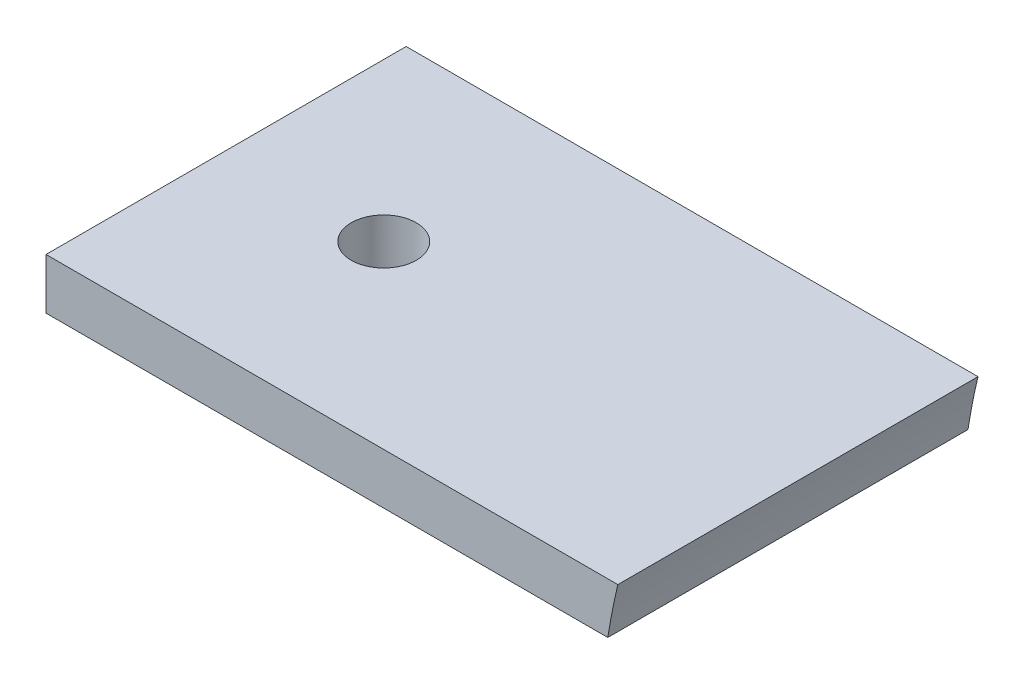
ISO-10303-21;
HEADER;
FILE_DESCRIPTION(('STEP AP214'),'2;1');
FILE_NAME('part.step','',(''),(''),'','','');
FILE_SCHEMA(('AUTOMOTIVE_DESIGN { 1 0 10303 214 1 1 1 1 }'));
ENDSEC;
DATA;
#1=APPLICATION_CONTEXT('core data for automotive mechanical design processes');
#2=APPLICATION_PROTOCOL_DEFINITION('international standard','automotive_design',2000,#1);
#3=PRODUCT_CONTEXT('',#1,'mechanical');
#4=PRODUCT('Part','Part','',(#3));
#5=PRODUCT_RELATED_PRODUCT_CATEGORY('part','',(#4));
#6=PRODUCT_DEFINITION_FORMATION('','',#4);
#7=PRODUCT_DEFINITION_CONTEXT('part definition',#1,'design');
#8=PRODUCT_DEFINITION('design','',#6,#7);
#9=PRODUCT_DEFINITION_SHAPE('','',#8);
#10=(LENGTH_UNIT() NAMED_UNIT(*) SI_UNIT(.MILLI.,.METRE.));
#11=(NAMED_UNIT(*) PLANE_ANGLE_UNIT() SI_UNIT($,.RADIAN.));
#12=(NAMED_UNIT(*) SI_UNIT($,.STERADIAN.) SOLID_ANGLE_UNIT());
#13=UNCERTAINTY_MEASURE_WITH_UNIT(LENGTH_MEASURE(1.E-05),#10,'distance_accuracy_value','');
#14=(GEOMETRIC_REPRESENTATION_CONTEXT(3) GLOBAL_UNCERTAINTY_ASSIGNED_CONTEXT((#13)) GLOBAL_UNIT_ASSIGNED_CONTEXT((#10,
#11,#12)) REPRESENTATION_CONTEXT('',''));
#15=CARTESIAN_POINT('',(0.,0.,0.));
#16=DIRECTION('',(0.,0.,1.));
#17=DIRECTION('',(1.,0.,0.));
#18=AXIS2_PLACEMENT_3D('',#15,#16,#17);
#19=CARTESIAN_POINT('',(-29.656098874284,20.5,291556.514563107));
#20=DIRECTION('',(1.,0.,0.));
#21=DIRECTION('',(0.,0.,-1.));
#22=AXIS2_PLACEMENT_3D('',#19,#20,#21);
#23=PLANE('',#22);
#24=DIRECTION('',(0.,1.,0.));
#25=VECTOR('',#24,1.);
#26=CARTESIAN_POINT('',(-29.656098874284,20.5,-7.39382756529494));
#27=LINE('',#26,#25);
#28=CARTESIAN_POINT('',(-29.656098874284,24.25,-7.39382756529494));
#29=VERTEX_POINT('',#28);
#30=CARTESIAN_POINT('',(-29.656098874284,25.5,-7.39382756529494));
#31=VERTEX_POINT('',#30);
#32=EDGE_CURVE('E40',#29,#31,#27,.T.);
#33=ORIENTED_EDGE('',*,*,#32,.F.);
#34=DIRECTION('',(0.,0.,1.));
#35=VECTOR('',#34,1.);
#36=CARTESIAN_POINT('',(-29.656098874284,24.25,291556.514563107));
#37=LINE('',#36,#35);
#38=CARTESIAN_POINT('',(-29.656098874284,24.25,1.46192518337784));
#39=VERTEX_POINT('',#38);
#40=EDGE_CURVE('E105',#29,#39,#37,.T.);
#41=ORIENTED_EDGE('',*,*,#40,.T.);
#42=DIRECTION('',(0.,1.,0.));
#43=VECTOR('',#42,1.);
#44=CARTESIAN_POINT('',(-29.656098874284,20.5,1.46192518337784));
#45=LINE('',#44,#43);
#46=CARTESIAN_POINT('',(-29.656098874284,25.5,1.46192518337784));
#47=VERTEX_POINT('',#46);
#48=EDGE_CURVE('E11',#39,#47,#45,.T.);
#49=ORIENTED_EDGE('',*,*,#48,.T.);
#50=DIRECTION('',(0.,0.,-1.));
#51=VECTOR('',#50,1.);
#52=CARTESIAN_POINT('',(-29.656098874284,25.5,291556.514563107));
#53=LINE('',#52,#51);
#54=EDGE_CURVE('E85',#47,#31,#53,.T.);
#55=ORIENTED_EDGE('',*,*,#54,.T.);
#56=EDGE_LOOP('',(#33,#41,#49,#55));
#57=FACE_BOUND('',#56,.T.);
#58=ADVANCED_FACE('F36',(#57),#23,.F.);
#59=CARTESIAN_POINT('',(-25.7794462528812,25.5,-2.96595119095855));
#60=DIRECTION('',(0.,1.,0.));
#61=DIRECTION('',(0.,0.,1.));
#62=AXIS2_PLACEMENT_3D('',#59,#60,#61);
#63=CYLINDRICAL_SURFACE('',#62,0.799999999999999);
#64=CARTESIAN_POINT('',(-25.7794462528812,24.25,-2.96595119095855));
#65=DIRECTION('',(0.,1.,0.));
#66=DIRECTION('',(-1.,0.,0.));
#67=AXIS2_PLACEMENT_3D('',#64,#65,#66);
#68=CIRCLE('',#67,0.799999999999999);
#69=CARTESIAN_POINT('',(-26.5794462528812,24.25,-2.96595119095855));
#70=VERTEX_POINT('',#69);
#71=EDGE_CURVE('E109',#70,#70,#68,.F.);
#72=ORIENTED_EDGE('',*,*,#71,.T.);
#73=EDGE_LOOP('',(#72));
#74=FACE_BOUND('',#73,.T.);
#75=CARTESIAN_POINT('',(-25.7794462528812,25.5,-2.96595119095855));
#76=DIRECTION('',(0.,1.,0.));
#77=DIRECTION('',(0.,0.,1.));
#78=AXIS2_PLACEMENT_3D('',#75,#76,#77);
#79=CIRCLE('',#78,0.799999999999999);
#80=CARTESIAN_POINT('',(-25.7794462528812,25.5,-2.16595119095855));
#81=VERTEX_POINT('',#80);
#82=EDGE_CURVE('E86',#81,#81,#79,.T.);
#83=ORIENTED_EDGE('',*,*,#82,.T.);
#84=EDGE_LOOP('',(#83));
#85=FACE_BOUND('',#84,.T.);
#86=ADVANCED_FACE('F125',(#74,#85),#63,.F.);
#87=CARTESIAN_POINT('',(0.,25.5,0.));
#88=DIRECTION('',(0.,-1.,0.));
#89=DIRECTION('',(0.,0.,-1.));
#90=AXIS2_PLACEMENT_3D('',#87,#88,#89);
#91=PLANE('',#90);
#92=DIRECTION('',(-1.,0.,0.));
#93=VECTOR('',#92,1.);
#94=CARTESIAN_POINT('',(-400002.038834951,25.5,-7.39382756529494));
#95=LINE('',#94,#93);
#96=CARTESIAN_POINT('',(-15.5961817667005,25.5,-7.39382756529494));
#97=VERTEX_POINT('',#96);
#98=EDGE_CURVE('E77',#97,#31,#95,.T.);
#99=ORIENTED_EDGE('',*,*,#98,.T.);
#100=ORIENTED_EDGE('',*,*,#54,.F.);
#101=DIRECTION('',(-1.,0.,0.));
#102=VECTOR('',#101,1.);
#103=CARTESIAN_POINT('',(-400002.038834951,25.5,1.46192518337784));
#104=LINE('',#103,#102);
#105=CARTESIAN_POINT('',(-15.5961817667005,25.5,1.46192518337784));
#106=VERTEX_POINT('',#105);
#107=EDGE_CURVE('E92',#106,#47,#104,.T.);
#108=ORIENTED_EDGE('',*,*,#107,.F.);
#109=DIRECTION('',(0.,0.,-1.));
#110=VECTOR('',#109,1.);
#111=CARTESIAN_POINT('',(-15.5961817667005,25.5,3.56748567590681));
#112=LINE('',#111,#110);
#113=EDGE_CURVE('E89',#97,#106,#112,.F.);
#114=ORIENTED_EDGE('',*,*,#113,.F.);
#115=EDGE_LOOP('',(#99,#100,#108,#114));
#116=FACE_BOUND('',#115,.T.);
#117=ORIENTED_EDGE('',*,*,#82,.F.);
#118=EDGE_LOOP('',(#117));
#119=FACE_BOUND('',#118,.T.);
#120=ADVANCED_FACE('F90',(#116,#119),#91,.F.);
#121=CARTESIAN_POINT('',(-34.2277855679569,24.25,-40.4854368932039));
#122=DIRECTION('',(0.,1.,0.));
#123=DIRECTION('',(-1.,0.,0.));
#124=AXIS2_PLACEMENT_3D('',#121,#122,#123);
#125=PLANE('',#124);
#126=ORIENTED_EDGE('',*,*,#71,.F.);
#127=EDGE_LOOP('',(#126));
#128=FACE_BOUND('',#127,.T.);
#129=DIRECTION('',(0.,0.,-1.));
#130=VECTOR('',#129,1.);
#131=CARTESIAN_POINT('',(-15.8427724909354,24.25,3.56748567590681));
#132=LINE('',#131,#130);
#133=CARTESIAN_POINT('',(-15.8427724909354,24.25,-7.39382756529494));
#134=VERTEX_POINT('',#133);
#135=CARTESIAN_POINT('',(-15.8427724909354,24.25,1.46192518337784));
#136=VERTEX_POINT('',#135);
#137=EDGE_CURVE('E96',#134,#136,#132,.F.);
#138=ORIENTED_EDGE('',*,*,#137,.T.);
#139=DIRECTION('',(1.,0.,0.));
#140=VECTOR('',#139,1.);
#141=CARTESIAN_POINT('',(-400002.038834951,24.2499999998934,1.46192518337784));
#142=LINE('',#141,#140);
#143=EDGE_CURVE('E107',#39,#136,#142,.T.);
#144=ORIENTED_EDGE('',*,*,#143,.F.);
#145=ORIENTED_EDGE('',*,*,#40,.F.);
#146=DIRECTION('',(1.,0.,0.));
#147=VECTOR('',#146,1.);
#148=CARTESIAN_POINT('',(-400002.038834951,24.2499999998934,-7.39382756529494));
#149=LINE('',#148,#147);
#150=EDGE_CURVE('E51',#29,#134,#149,.T.);
#151=ORIENTED_EDGE('',*,*,#150,.T.);
#152=EDGE_LOOP('',(#138,#144,#145,#151));
#153=FACE_BOUND('',#152,.T.);
#154=ADVANCED_FACE('F117',(#128,#153),#125,.F.);
#155=CARTESIAN_POINT('',(-400002.038834951,20.5,-7.39382756529494));
#156=DIRECTION('',(0.,0.,-1.));
#157=DIRECTION('',(-1.,0.,0.));
#158=AXIS2_PLACEMENT_3D('',#155,#156,#157);
#159=PLANE('',#158);
#160=ORIENTED_EDGE('',*,*,#150,.F.);
#161=ORIENTED_EDGE('',*,*,#32,.T.);
#162=ORIENTED_EDGE('',*,*,#98,.F.);
#163=CARTESIAN_POINT('',(-0.0344541676912807,21.7807750626998,-7.39382756529494));
#164=DIRECTION('',(0.,0.,-1.));
#165=DIRECTION('',(-1.,0.,0.));
#166=AXIS2_PLACEMENT_3D('',#163,#164,#165);
#167=CIRCLE('',#166,16.);
#168=EDGE_CURVE('E80',#134,#97,#167,.T.);
#169=ORIENTED_EDGE('',*,*,#168,.F.);
#170=EDGE_LOOP('',(#160,#161,#162,#169));
#171=FACE_BOUND('',#170,.T.);
#172=ADVANCED_FACE('F38',(#171),#159,.T.);
#173=CARTESIAN_POINT('',(-400002.038834951,20.5,1.46192518337784));
#174=DIRECTION('',(0.,0.,-1.));
#175=DIRECTION('',(-1.,0.,0.));
#176=AXIS2_PLACEMENT_3D('',#173,#174,#175);
#177=PLANE('',#176);
#178=ORIENTED_EDGE('',*,*,#48,.F.);
#179=ORIENTED_EDGE('',*,*,#143,.T.);
#180=CARTESIAN_POINT('',(-0.0344541676912807,21.7807750626998,1.46192518337784));
#181=DIRECTION('',(0.,0.,1.));
#182=DIRECTION('',(1.,0.,0.));
#183=AXIS2_PLACEMENT_3D('',#180,#181,#182);
#184=CIRCLE('',#183,16.);
#185=EDGE_CURVE('E97',#106,#136,#184,.T.);
#186=ORIENTED_EDGE('',*,*,#185,.F.);
#187=ORIENTED_EDGE('',*,*,#107,.T.);
#188=EDGE_LOOP('',(#178,#179,#186,#187));
#189=FACE_BOUND('',#188,.T.);
#190=ADVANCED_FACE('F116',(#189),#177,.F.);
#191=CARTESIAN_POINT('',(-0.0344541676912807,21.7807750626998,3.56748567590681));
#192=DIRECTION('',(0.,0.,-1.));
#193=DIRECTION('',(-1.,0.,0.));
#194=AXIS2_PLACEMENT_3D('',#191,#192,#193);
#195=CYLINDRICAL_SURFACE('',#194,16.);
#196=ORIENTED_EDGE('',*,*,#113,.T.);
#197=ORIENTED_EDGE('',*,*,#185,.T.);
#198=ORIENTED_EDGE('',*,*,#137,.F.);
#199=ORIENTED_EDGE('',*,*,#168,.T.);
#200=EDGE_LOOP('',(#196,#197,#198,#199));
#201=FACE_BOUND('',#200,.T.);
#202=ADVANCED_FACE('F99',(#201),#195,.F.);
#203=CLOSED_SHELL('',(#58,#86,#120,#154,#172,#190,#202));
#204=MANIFOLD_SOLID_BREP('B2',#203);
#205=ADVANCED_BREP_SHAPE_REPRESENTATION('',(#18,#204),#14);
#206=SHAPE_DEFINITION_REPRESENTATION(#9,#205);
ENDSEC;
END-ISO-10303-21;
